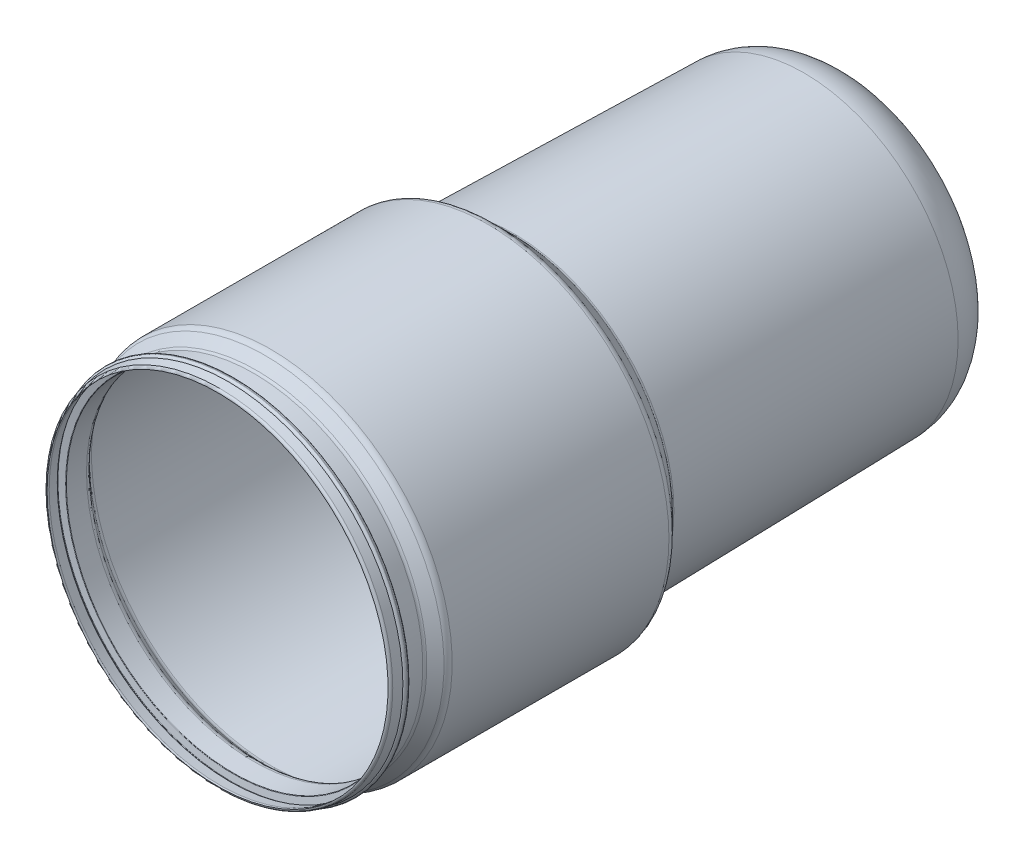
ISO-10303-21;
HEADER;
FILE_DESCRIPTION(('STEP AP214'),'2;1');
FILE_NAME('part.step','',(''),(''),'','','');
FILE_SCHEMA(('AUTOMOTIVE_DESIGN { 1 0 10303 214 1 1 1 1 }'));
ENDSEC;
DATA;
#1=APPLICATION_CONTEXT('core data for automotive mechanical design processes');
#2=APPLICATION_PROTOCOL_DEFINITION('international standard','automotive_design',2000,#1);
#3=PRODUCT_CONTEXT('',#1,'mechanical');
#4=PRODUCT('Part','Part','',(#3));
#5=PRODUCT_RELATED_PRODUCT_CATEGORY('part','',(#4));
#6=PRODUCT_DEFINITION_FORMATION('','',#4);
#7=PRODUCT_DEFINITION_CONTEXT('part definition',#1,'design');
#8=PRODUCT_DEFINITION('design','',#6,#7);
#9=PRODUCT_DEFINITION_SHAPE('','',#8);
#10=(LENGTH_UNIT() NAMED_UNIT(*) SI_UNIT(.MILLI.,.METRE.));
#11=(NAMED_UNIT(*) PLANE_ANGLE_UNIT() SI_UNIT($,.RADIAN.));
#12=(NAMED_UNIT(*) SI_UNIT($,.STERADIAN.) SOLID_ANGLE_UNIT());
#13=UNCERTAINTY_MEASURE_WITH_UNIT(LENGTH_MEASURE(1.E-05),#10,'distance_accuracy_value','');
#14=(GEOMETRIC_REPRESENTATION_CONTEXT(3) GLOBAL_UNCERTAINTY_ASSIGNED_CONTEXT((#13)) GLOBAL_UNIT_ASSIGNED_CONTEXT((#10,
#11,#12)) REPRESENTATION_CONTEXT('',''));
#15=CARTESIAN_POINT('',(0.,0.,0.));
#16=DIRECTION('',(0.,0.,1.));
#17=DIRECTION('',(1.,0.,0.));
#18=AXIS2_PLACEMENT_3D('',#15,#16,#17);
#19=CARTESIAN_POINT('',(0.,0.,660.4));
#20=DIRECTION('',(0.,0.,-1.));
#21=DIRECTION('',(-1.,0.,0.));
#22=AXIS2_PLACEMENT_3D('',#19,#20,#21);
#23=CYLINDRICAL_SURFACE('',#22,178.167487387362);
#24=CARTESIAN_POINT('',(0.,0.,660.4));
#25=DIRECTION('',(0.,0.,-1.));
#26=DIRECTION('',(-1.,0.,0.));
#27=AXIS2_PLACEMENT_3D('',#24,#25,#26);
#28=CIRCLE('',#27,178.167487387362);
#29=CARTESIAN_POINT('',(-178.167487387362,0.,660.4));
#30=VERTEX_POINT('',#29);
#31=EDGE_CURVE('E148',#30,#30,#28,.F.);
#32=ORIENTED_EDGE('',*,*,#31,.F.);
#33=EDGE_LOOP('',(#32));
#34=FACE_BOUND('',#33,.T.);
#35=CARTESIAN_POINT('',(0.,0.,662.6));
#36=DIRECTION('',(0.,0.,-1.));
#37=DIRECTION('',(-1.,0.,0.));
#38=AXIS2_PLACEMENT_3D('',#35,#36,#37);
#39=CIRCLE('',#38,178.167487387362);
#40=CARTESIAN_POINT('',(-178.167487387362,0.,662.6));
#41=VERTEX_POINT('',#40);
#42=EDGE_CURVE('E12',#41,#41,#39,.F.);
#43=ORIENTED_EDGE('',*,*,#42,.T.);
#44=EDGE_LOOP('',(#43));
#45=FACE_BOUND('',#44,.T.);
#46=ADVANCED_FACE('F48',(#34,#45),#23,.F.);
#47=CARTESIAN_POINT('',(0.,0.,-2.20000000000001));
#48=DIRECTION('',(0.,0.,1.));
#49=DIRECTION('',(1.,0.,0.));
#50=AXIS2_PLACEMENT_3D('',#47,#48,#49);
#51=PLANE('',#50);
#52=CARTESIAN_POINT('',(0.,0.,-2.20000000000002));
#53=DIRECTION('',(0.,0.,-1.));
#54=DIRECTION('',(-1.,0.,0.));
#55=AXIS2_PLACEMENT_3D('',#52,#53,#54);
#56=CIRCLE('',#55,107.960944884122);
#57=CARTESIAN_POINT('',(-107.960944884122,0.,-2.20000000000002));
#58=VERTEX_POINT('',#57);
#59=EDGE_CURVE('E112',#58,#58,#56,.T.);
#60=ORIENTED_EDGE('',*,*,#59,.T.);
#61=EDGE_LOOP('',(#60));
#62=FACE_BOUND('',#61,.T.);
#63=ADVANCED_FACE('F219',(#62),#51,.F.);
#64=CARTESIAN_POINT('',(0.,0.,50.8));
#65=DIRECTION('',(0.,0.,-1.));
#66=DIRECTION('',(-1.,0.,0.));
#67=AXIS2_PLACEMENT_3D('',#64,#65,#66);
#68=TOROIDAL_SURFACE('',#67,107.960944884122,53.);
#69=ORIENTED_EDGE('',*,*,#59,.F.);
#70=EDGE_LOOP('',(#69));
#71=FACE_BOUND('',#70,.T.);
#72=CARTESIAN_POINT('',(0.,0.,49.6998771082544));
#73=DIRECTION('',(0.,0.,-1.));
#74=DIRECTION('',(-1.,0.,0.));
#75=AXIS2_PLACEMENT_3D('',#72,#73,#74);
#76=CIRCLE('',#75,160.949526008955);
#77=CARTESIAN_POINT('',(-160.949526008955,0.,49.6998771082544));
#78=VERTEX_POINT('',#77);
#79=EDGE_CURVE('E113',#78,#78,#76,.T.);
#80=ORIENTED_EDGE('',*,*,#79,.T.);
#81=EDGE_LOOP('',(#80));
#82=FACE_BOUND('',#81,.T.);
#83=ADVANCED_FACE('F225',(#71,#82),#68,.T.);
#84=CARTESIAN_POINT('',(0.,0.,355.554334521475));
#85=DIRECTION('',(0.,0.,1.));
#86=DIRECTION('',(1.,0.,0.));
#87=AXIS2_PLACEMENT_3D('',#84,#85,#86);
#88=CONICAL_SURFACE('',#87,167.299526008955,0.0207585265261919);
#89=CARTESIAN_POINT('',(0.,0.,353.001517125793));
#90=DIRECTION('',(0.,0.,1.));
#91=DIRECTION('',(1.,0.,0.));
#92=AXIS2_PLACEMENT_3D('',#89,#90,#91);
#93=CIRCLE('',#92,167.246525668206);
#94=CARTESIAN_POINT('',(167.246525668206,0.,353.001517125793));
#95=VERTEX_POINT('',#94);
#96=EDGE_CURVE('E105',#95,#95,#93,.F.);
#97=ORIENTED_EDGE('',*,*,#96,.T.);
#98=EDGE_LOOP('',(#97));
#99=FACE_BOUND('',#98,.T.);
#100=ORIENTED_EDGE('',*,*,#79,.F.);
#101=EDGE_LOOP('',(#100));
#102=FACE_BOUND('',#101,.T.);
#103=ADVANCED_FACE('F235',(#99,#102),#88,.T.);
#104=CARTESIAN_POINT('',(0.,0.,376.269365081389));
#105=DIRECTION('',(0.,0.,1.));
#106=DIRECTION('',(1.,0.,0.));
#107=AXIS2_PLACEMENT_3D('',#104,#105,#106);
#108=CONICAL_SURFACE('',#107,188.88063491861,0.785398163397451);
#109=CARTESIAN_POINT('',(0.,0.,355.849868569591));
#110=DIRECTION('',(0.,0.,1.));
#111=DIRECTION('',(1.,0.,0.));
#112=AXIS2_PLACEMENT_3D('',#109,#110,#111);
#113=CIRCLE('',#112,168.461138406811);
#114=CARTESIAN_POINT('',(168.461138406811,0.,355.849868569591));
#115=VERTEX_POINT('',#114);
#116=EDGE_CURVE('E97',#115,#115,#113,.T.);
#117=ORIENTED_EDGE('',*,*,#116,.T.);
#118=EDGE_LOOP('',(#117));
#119=FACE_BOUND('',#118,.T.);
#120=CARTESIAN_POINT('',(0.,0.,374.409493141924));
#121=DIRECTION('',(0.,0.,1.));
#122=DIRECTION('',(1.,0.,0.));
#123=AXIS2_PLACEMENT_3D('',#120,#121,#122);
#124=CIRCLE('',#123,187.020762979145);
#125=CARTESIAN_POINT('',(187.020762979145,0.,374.409493141924));
#126=VERTEX_POINT('',#125);
#127=EDGE_CURVE('E101',#126,#126,#124,.F.);
#128=ORIENTED_EDGE('',*,*,#127,.T.);
#129=EDGE_LOOP('',(#128));
#130=FACE_BOUND('',#129,.T.);
#131=ADVANCED_FACE('F239',(#119,#130),#108,.T.);
#132=CARTESIAN_POINT('',(0.,0.,0.));
#133=DIRECTION('',(0.,0.,-1.));
#134=DIRECTION('',(-1.,0.,0.));
#135=AXIS2_PLACEMENT_3D('',#132,#133,#134);
#136=CYLINDRICAL_SURFACE('',#135,189.525);
#137=CARTESIAN_POINT('',(0.,0.,380.455256121069));
#138=DIRECTION('',(0.,0.,-1.));
#139=DIRECTION('',(-1.,0.,0.));
#140=AXIS2_PLACEMENT_3D('',#137,#138,#139);
#141=CIRCLE('',#140,189.525);
#142=CARTESIAN_POINT('',(-189.525,0.,380.455256121069));
#143=VERTEX_POINT('',#142);
#144=EDGE_CURVE('E89',#143,#143,#141,.F.);
#145=ORIENTED_EDGE('',*,*,#144,.T.);
#146=EDGE_LOOP('',(#145));
#147=FACE_BOUND('',#146,.T.);
#148=CARTESIAN_POINT('',(0.,0.,606.969743878931));
#149=DIRECTION('',(0.,0.,-1.));
#150=DIRECTION('',(-1.,0.,0.));
#151=AXIS2_PLACEMENT_3D('',#148,#149,#150);
#152=CIRCLE('',#151,189.525);
#153=CARTESIAN_POINT('',(-189.525,0.,606.969743878931));
#154=VERTEX_POINT('',#153);
#155=EDGE_CURVE('E93',#154,#154,#152,.T.);
#156=ORIENTED_EDGE('',*,*,#155,.T.);
#157=EDGE_LOOP('',(#156));
#158=FACE_BOUND('',#157,.T.);
#159=ADVANCED_FACE('F243',(#147,#158),#136,.T.);
#160=CARTESIAN_POINT('',(0.,0.,623.85563491861));
#161=DIRECTION('',(0.,0.,-1.));
#162=DIRECTION('',(-1.,0.,0.));
#163=AXIS2_PLACEMENT_3D('',#160,#161,#162);
#164=CONICAL_SURFACE('',#163,176.18063491861,0.78539816339745);
#165=CARTESIAN_POINT('',(0.,0.,613.015506858076));
#166=DIRECTION('',(0.,0.,-1.));
#167=DIRECTION('',(-1.,0.,0.));
#168=AXIS2_PLACEMENT_3D('',#165,#166,#167);
#169=CIRCLE('',#168,187.020762979145);
#170=CARTESIAN_POINT('',(-187.020762979145,0.,613.015506858076));
#171=VERTEX_POINT('',#170);
#172=EDGE_CURVE('E84',#171,#171,#169,.F.);
#173=ORIENTED_EDGE('',*,*,#172,.T.);
#174=EDGE_LOOP('',(#173));
#175=FACE_BOUND('',#174,.T.);
#176=CARTESIAN_POINT('',(0.,0.,621.995762979145));
#177=DIRECTION('',(0.,0.,-1.));
#178=DIRECTION('',(-1.,0.,0.));
#179=AXIS2_PLACEMENT_3D('',#176,#177,#178);
#180=CIRCLE('',#179,178.040506858076);
#181=CARTESIAN_POINT('',(-178.040506858076,0.,621.995762979145));
#182=VERTEX_POINT('',#181);
#183=EDGE_CURVE('E85',#182,#182,#180,.T.);
#184=ORIENTED_EDGE('',*,*,#183,.T.);
#185=EDGE_LOOP('',(#184));
#186=FACE_BOUND('',#185,.T.);
#187=ADVANCED_FACE('F247',(#175,#186),#164,.T.);
#188=CARTESIAN_POINT('',(0.,0.,0.));
#189=DIRECTION('',(0.,0.,-1.));
#190=DIRECTION('',(-1.,0.,0.));
#191=AXIS2_PLACEMENT_3D('',#188,#189,#190);
#192=CYLINDRICAL_SURFACE('',#191,176.825);
#193=CARTESIAN_POINT('',(0.,0.,644.528763019001));
#194=DIRECTION('',(0.,0.,1.));
#195=DIRECTION('',(1.,0.,0.));
#196=AXIS2_PLACEMENT_3D('',#193,#194,#195);
#197=CIRCLE('',#196,176.825);
#198=CARTESIAN_POINT('',(176.825,0.,644.528763019001));
#199=VERTEX_POINT('',#198);
#200=EDGE_CURVE('E57',#199,#199,#197,.F.);
#201=ORIENTED_EDGE('',*,*,#200,.T.);
#202=EDGE_LOOP('',(#201));
#203=FACE_BOUND('',#202,.T.);
#204=CARTESIAN_POINT('',(0.,0.,624.930256121069));
#205=DIRECTION('',(0.,0.,-1.));
#206=DIRECTION('',(-1.,0.,0.));
#207=AXIS2_PLACEMENT_3D('',#204,#205,#206);
#208=CIRCLE('',#207,176.825);
#209=CARTESIAN_POINT('',(-176.825,0.,624.930256121069));
#210=VERTEX_POINT('',#209);
#211=EDGE_CURVE('E69',#210,#210,#208,.F.);
#212=ORIENTED_EDGE('',*,*,#211,.T.);
#213=EDGE_LOOP('',(#212));
#214=FACE_BOUND('',#213,.T.);
#215=ADVANCED_FACE('F251',(#203,#214),#192,.T.);
#216=CARTESIAN_POINT('',(0.,0.,645.533422943373));
#217=DIRECTION('',(0.,0.,1.));
#218=DIRECTION('',(1.,0.,0.));
#219=AXIS2_PLACEMENT_3D('',#216,#217,#218);
#220=CONICAL_SURFACE('',#219,182.52270956399,1.39626340159547);
#221=CARTESIAN_POINT('',(0.,0.,645.459403217481));
#222=DIRECTION('',(0.,0.,1.));
#223=DIRECTION('',(1.,0.,0.));
#224=AXIS2_PLACEMENT_3D('',#221,#222,#223);
#225=CIRCLE('',#224,182.102922838245);
#226=CARTESIAN_POINT('',(182.102922838245,0.,645.459403217481));
#227=VERTEX_POINT('',#226);
#228=EDGE_CURVE('E62',#227,#227,#225,.F.);
#229=ORIENTED_EDGE('',*,*,#228,.T.);
#230=EDGE_LOOP('',(#229));
#231=FACE_BOUND('',#230,.T.);
#232=ORIENTED_EDGE('',*,*,#200,.F.);
#233=EDGE_LOOP('',(#232));
#234=FACE_BOUND('',#233,.T.);
#235=ADVANCED_FACE('F255',(#231,#234),#220,.T.);
#236=CARTESIAN_POINT('',(0.,0.,0.));
#237=DIRECTION('',(0.,0.,-1.));
#238=DIRECTION('',(-1.,0.,0.));
#239=AXIS2_PLACEMENT_3D('',#236,#237,#238);
#240=CYLINDRICAL_SURFACE('',#239,184.340683573123);
#241=CARTESIAN_POINT('',(0.,0.,648.7795));
#242=DIRECTION('',(0.,0.,-1.));
#243=DIRECTION('',(-1.,0.,0.));
#244=AXIS2_PLACEMENT_3D('',#241,#242,#243);
#245=CIRCLE('',#244,184.340683573123);
#246=CARTESIAN_POINT('',(-184.340683573123,0.,648.7795));
#247=VERTEX_POINT('',#246);
#248=EDGE_CURVE('E70',#247,#247,#245,.T.);
#249=ORIENTED_EDGE('',*,*,#248,.T.);
#250=EDGE_LOOP('',(#249));
#251=FACE_BOUND('',#250,.T.);
#252=CARTESIAN_POINT('',(0.,0.,648.126262612638));
#253=DIRECTION('',(0.,0.,-1.));
#254=DIRECTION('',(-1.,0.,0.));
#255=AXIS2_PLACEMENT_3D('',#252,#253,#254);
#256=CIRCLE('',#255,184.340683573123);
#257=CARTESIAN_POINT('',(-184.340683573123,0.,648.126262612638));
#258=VERTEX_POINT('',#257);
#259=EDGE_CURVE('E74',#258,#258,#256,.F.);
#260=ORIENTED_EDGE('',*,*,#259,.T.);
#261=EDGE_LOOP('',(#260));
#262=FACE_BOUND('',#261,.T.);
#263=ADVANCED_FACE('F259',(#251,#262),#240,.T.);
#264=CARTESIAN_POINT('',(0.,0.,660.782025990867));
#265=DIRECTION('',(0.,0.,-1.));
#266=DIRECTION('',(-1.,0.,0.));
#267=AXIS2_PLACEMENT_3D('',#264,#265,#266);
#268=CONICAL_SURFACE('',#267,180.760327056627,0.174532925199429);
#269=CARTESIAN_POINT('',(0.,0.,660.362239265122));
#270=DIRECTION('',(0.,0.,-1.));
#271=DIRECTION('',(-1.,0.,0.));
#272=AXIS2_PLACEMENT_3D('',#269,#270,#271);
#273=CIRCLE('',#272,180.834346782519);
#274=CARTESIAN_POINT('',(-180.834346782519,0.,660.362239265122));
#275=VERTEX_POINT('',#274);
#276=EDGE_CURVE('E65',#275,#275,#273,.T.);
#277=ORIENTED_EDGE('',*,*,#276,.T.);
#278=EDGE_LOOP('',(#277));
#279=FACE_BOUND('',#278,.T.);
#280=CARTESIAN_POINT('',(0.,0.,651.370577225404));
#281=DIRECTION('',(0.,0.,-1.));
#282=DIRECTION('',(-1.,0.,0.));
#283=AXIS2_PLACEMENT_3D('',#280,#281,#282);
#284=CIRCLE('',#283,182.419819401533);
#285=CARTESIAN_POINT('',(-182.419819401533,0.,651.370577225404));
#286=VERTEX_POINT('',#285);
#287=EDGE_CURVE('E52',#286,#286,#284,.F.);
#288=ORIENTED_EDGE('',*,*,#287,.T.);
#289=EDGE_LOOP('',(#288));
#290=FACE_BOUND('',#289,.T.);
#291=ADVANCED_FACE('F263',(#279,#290),#268,.T.);
#292=CARTESIAN_POINT('',(0.,0.,352.915375427666));
#293=DIRECTION('',(0.,0.,-1.));
#294=DIRECTION('',(-1.,0.,0.));
#295=AXIS2_PLACEMENT_3D('',#292,#293,#294);
#296=TOROIDAL_SURFACE('',#295,171.395631548736,4.15);
#297=ORIENTED_EDGE('',*,*,#116,.F.);
#298=EDGE_LOOP('',(#297));
#299=FACE_BOUND('',#298,.T.);
#300=ORIENTED_EDGE('',*,*,#96,.F.);
#301=EDGE_LOOP('',(#300));
#302=FACE_BOUND('',#301,.T.);
#303=ADVANCED_FACE('F267',(#299,#302),#296,.F.);
#304=CARTESIAN_POINT('',(0.,0.,380.455256121069));
#305=DIRECTION('',(0.,0.,1.));
#306=DIRECTION('',(1.,0.,0.));
#307=AXIS2_PLACEMENT_3D('',#304,#305,#306);
#308=TOROIDAL_SURFACE('',#307,180.975,8.55);
#309=ORIENTED_EDGE('',*,*,#144,.F.);
#310=EDGE_LOOP('',(#309));
#311=FACE_BOUND('',#310,.T.);
#312=ORIENTED_EDGE('',*,*,#127,.F.);
#313=EDGE_LOOP('',(#312));
#314=FACE_BOUND('',#313,.T.);
#315=ADVANCED_FACE('F271',(#311,#314),#308,.T.);
#316=CARTESIAN_POINT('',(0.,0.,606.969743878931));
#317=DIRECTION('',(0.,0.,1.));
#318=DIRECTION('',(1.,0.,0.));
#319=AXIS2_PLACEMENT_3D('',#316,#317,#318);
#320=TOROIDAL_SURFACE('',#319,180.975,8.55);
#321=ORIENTED_EDGE('',*,*,#172,.F.);
#322=EDGE_LOOP('',(#321));
#323=FACE_BOUND('',#322,.T.);
#324=ORIENTED_EDGE('',*,*,#155,.F.);
#325=EDGE_LOOP('',(#324));
#326=FACE_BOUND('',#325,.T.);
#327=ADVANCED_FACE('F275',(#323,#326),#320,.T.);
#328=CARTESIAN_POINT('',(0.,0.,624.930256121069));
#329=DIRECTION('',(0.,0.,-1.));
#330=DIRECTION('',(-1.,0.,0.));
#331=AXIS2_PLACEMENT_3D('',#328,#329,#330);
#332=TOROIDAL_SURFACE('',#331,180.975,4.15);
#333=ORIENTED_EDGE('',*,*,#211,.F.);
#334=EDGE_LOOP('',(#333));
#335=FACE_BOUND('',#334,.T.);
#336=ORIENTED_EDGE('',*,*,#183,.F.);
#337=EDGE_LOOP('',(#336));
#338=FACE_BOUND('',#337,.T.);
#339=ADVANCED_FACE('F279',(#335,#338),#332,.F.);
#340=CARTESIAN_POINT('',(0.,0.,659.892));
#341=DIRECTION('',(0.,0.,-1.));
#342=DIRECTION('',(-1.,0.,0.));
#343=AXIS2_PLACEMENT_3D('',#340,#341,#342);
#344=TOROIDAL_SURFACE('',#343,178.167487387362,2.708);
#345=ORIENTED_EDGE('',*,*,#42,.F.);
#346=EDGE_LOOP('',(#345));
#347=FACE_BOUND('',#346,.T.);
#348=ORIENTED_EDGE('',*,*,#276,.F.);
#349=EDGE_LOOP('',(#348));
#350=FACE_BOUND('',#349,.T.);
#351=ADVANCED_FACE('F283',(#347,#350),#344,.T.);
#352=CARTESIAN_POINT('',(0.,0.,648.7795));
#353=DIRECTION('',(0.,0.,-1.));
#354=DIRECTION('',(-1.,0.,0.));
#355=AXIS2_PLACEMENT_3D('',#352,#353,#354);
#356=TOROIDAL_SURFACE('',#355,181.632683573123,2.708);
#357=ORIENTED_EDGE('',*,*,#287,.F.);
#358=EDGE_LOOP('',(#357));
#359=FACE_BOUND('',#358,.T.);
#360=ORIENTED_EDGE('',*,*,#248,.F.);
#361=EDGE_LOOP('',(#360));
#362=FACE_BOUND('',#361,.T.);
#363=ADVANCED_FACE('F50',(#359,#362),#356,.T.);
#364=CARTESIAN_POINT('',(0.,0.,648.126262612638));
#365=DIRECTION('',(0.,0.,1.));
#366=DIRECTION('',(1.,0.,0.));
#367=AXIS2_PLACEMENT_3D('',#364,#365,#366);
#368=TOROIDAL_SURFACE('',#367,181.632683573123,2.708);
#369=ORIENTED_EDGE('',*,*,#259,.F.);
#370=EDGE_LOOP('',(#369));
#371=FACE_BOUND('',#370,.T.);
#372=ORIENTED_EDGE('',*,*,#228,.F.);
#373=EDGE_LOOP('',(#372));
#374=FACE_BOUND('',#373,.T.);
#375=ADVANCED_FACE('F215',(#371,#374),#368,.T.);
#376=CARTESIAN_POINT('',(0.,0.,0.));
#377=DIRECTION('',(0.,0.,1.));
#378=DIRECTION('',(1.,0.,0.));
#379=AXIS2_PLACEMENT_3D('',#376,#377,#378);
#380=PLANE('',#379);
#381=CARTESIAN_POINT('',(0.,0.,0.));
#382=DIRECTION('',(0.,0.,-1.));
#383=DIRECTION('',(-1.,0.,0.));
#384=AXIS2_PLACEMENT_3D('',#381,#382,#383);
#385=CIRCLE('',#384,107.960944884122);
#386=CARTESIAN_POINT('',(-107.960944884122,0.,0.));
#387=VERTEX_POINT('',#386);
#388=EDGE_CURVE('E192',#387,#387,#385,.T.);
#389=ORIENTED_EDGE('',*,*,#388,.F.);
#390=EDGE_LOOP('',(#389));
#391=FACE_BOUND('',#390,.T.);
#392=ADVANCED_FACE('F205',(#391),#380,.T.);
#393=CARTESIAN_POINT('',(0.,0.,50.8));
#394=DIRECTION('',(0.,0.,-1.));
#395=DIRECTION('',(-1.,0.,0.));
#396=AXIS2_PLACEMENT_3D('',#393,#394,#395);
#397=TOROIDAL_SURFACE('',#396,107.960944884122,50.8);
#398=ORIENTED_EDGE('',*,*,#388,.T.);
#399=EDGE_LOOP('',(#398));
#400=FACE_BOUND('',#399,.T.);
#401=CARTESIAN_POINT('',(0.,0.,49.7455425867797));
#402=DIRECTION('',(0.,0.,-1.));
#403=DIRECTION('',(-1.,0.,0.));
#404=AXIS2_PLACEMENT_3D('',#401,#402,#403);
#405=CIRCLE('',#404,158.75);
#406=CARTESIAN_POINT('',(-158.75,0.,49.7455425867797));
#407=VERTEX_POINT('',#406);
#408=EDGE_CURVE('E196',#407,#407,#405,.T.);
#409=ORIENTED_EDGE('',*,*,#408,.F.);
#410=EDGE_LOOP('',(#409));
#411=FACE_BOUND('',#410,.T.);
#412=ADVANCED_FACE('F203',(#400,#411),#397,.F.);
#413=CARTESIAN_POINT('',(0.,0.,355.6));
#414=DIRECTION('',(0.,0.,1.));
#415=DIRECTION('',(1.,0.,0.));
#416=AXIS2_PLACEMENT_3D('',#413,#414,#415);
#417=CONICAL_SURFACE('',#416,165.1,0.0207585265261919);
#418=CARTESIAN_POINT('',(0.,0.,353.047182604319));
#419=DIRECTION('',(0.,0.,1.));
#420=DIRECTION('',(1.,0.,0.));
#421=AXIS2_PLACEMENT_3D('',#418,#419,#420);
#422=CIRCLE('',#421,165.046999659251);
#423=CARTESIAN_POINT('',(165.046999659251,0.,353.047182604319));
#424=VERTEX_POINT('',#423);
#425=EDGE_CURVE('E188',#424,#424,#422,.F.);
#426=ORIENTED_EDGE('',*,*,#425,.F.);
#427=EDGE_LOOP('',(#426));
#428=FACE_BOUND('',#427,.T.);
#429=ORIENTED_EDGE('',*,*,#408,.T.);
#430=EDGE_LOOP('',(#429));
#431=FACE_BOUND('',#430,.T.);
#432=ADVANCED_FACE('F201',(#428,#431),#417,.F.);
#433=CARTESIAN_POINT('',(0.,0.,377.825));
#434=DIRECTION('',(0.,0.,1.));
#435=DIRECTION('',(1.,0.,0.));
#436=AXIS2_PLACEMENT_3D('',#433,#434,#435);
#437=CONICAL_SURFACE('',#436,187.325,0.785398163397451);
#438=CARTESIAN_POINT('',(0.,0.,357.405503488201));
#439=DIRECTION('',(0.,0.,1.));
#440=DIRECTION('',(1.,0.,0.));
#441=AXIS2_PLACEMENT_3D('',#438,#439,#440);
#442=CIRCLE('',#441,166.905503488201);
#443=CARTESIAN_POINT('',(166.905503488201,0.,357.405503488201));
#444=VERTEX_POINT('',#443);
#445=EDGE_CURVE('E180',#444,#444,#442,.T.);
#446=ORIENTED_EDGE('',*,*,#445,.F.);
#447=EDGE_LOOP('',(#446));
#448=FACE_BOUND('',#447,.T.);
#449=CARTESIAN_POINT('',(0.,0.,375.965128060534));
#450=DIRECTION('',(0.,0.,-1.));
#451=DIRECTION('',(-1.,0.,0.));
#452=AXIS2_PLACEMENT_3D('',#449,#450,#451);
#453=CIRCLE('',#452,185.465128060535);
#454=CARTESIAN_POINT('',(-185.465128060535,0.,375.965128060534));
#455=VERTEX_POINT('',#454);
#456=EDGE_CURVE('E184',#455,#455,#453,.T.);
#457=ORIENTED_EDGE('',*,*,#456,.F.);
#458=EDGE_LOOP('',(#457));
#459=FACE_BOUND('',#458,.T.);
#460=ADVANCED_FACE('F212',(#448,#459),#437,.F.);
#461=CARTESIAN_POINT('',(0.,0.,0.));
#462=DIRECTION('',(0.,0.,-1.));
#463=DIRECTION('',(-1.,0.,0.));
#464=AXIS2_PLACEMENT_3D('',#461,#462,#463);
#465=CYLINDRICAL_SURFACE('',#464,187.325);
#466=CARTESIAN_POINT('',(0.,0.,380.455256121069));
#467=DIRECTION('',(0.,0.,1.));
#468=DIRECTION('',(1.,0.,0.));
#469=AXIS2_PLACEMENT_3D('',#466,#467,#468);
#470=CIRCLE('',#469,187.325);
#471=CARTESIAN_POINT('',(187.325,0.,380.455256121069));
#472=VERTEX_POINT('',#471);
#473=EDGE_CURVE('E172',#472,#472,#470,.T.);
#474=ORIENTED_EDGE('',*,*,#473,.F.);
#475=EDGE_LOOP('',(#474));
#476=FACE_BOUND('',#475,.T.);
#477=CARTESIAN_POINT('',(0.,0.,606.969743878931));
#478=DIRECTION('',(0.,0.,1.));
#479=DIRECTION('',(1.,0.,0.));
#480=AXIS2_PLACEMENT_3D('',#477,#478,#479);
#481=CIRCLE('',#480,187.325);
#482=CARTESIAN_POINT('',(187.325,0.,606.969743878931));
#483=VERTEX_POINT('',#482);
#484=EDGE_CURVE('E176',#483,#483,#481,.F.);
#485=ORIENTED_EDGE('',*,*,#484,.F.);
#486=EDGE_LOOP('',(#485));
#487=FACE_BOUND('',#486,.T.);
#488=ADVANCED_FACE('F524',(#476,#487),#465,.F.);
#489=CARTESIAN_POINT('',(0.,0.,622.3));
#490=DIRECTION('',(0.,0.,-1.));
#491=DIRECTION('',(-1.,0.,0.));
#492=AXIS2_PLACEMENT_3D('',#489,#490,#491);
#493=CONICAL_SURFACE('',#492,174.625,0.78539816339745);
#494=CARTESIAN_POINT('',(0.,0.,611.459871939466));
#495=DIRECTION('',(0.,0.,1.));
#496=DIRECTION('',(1.,0.,0.));
#497=AXIS2_PLACEMENT_3D('',#494,#495,#496);
#498=CIRCLE('',#497,185.465128060535);
#499=CARTESIAN_POINT('',(185.465128060535,0.,611.459871939466));
#500=VERTEX_POINT('',#499);
#501=EDGE_CURVE('E164',#500,#500,#498,.T.);
#502=ORIENTED_EDGE('',*,*,#501,.F.);
#503=EDGE_LOOP('',(#502));
#504=FACE_BOUND('',#503,.T.);
#505=CARTESIAN_POINT('',(0.,0.,620.440128060535));
#506=DIRECTION('',(0.,0.,-1.));
#507=DIRECTION('',(-1.,0.,0.));
#508=AXIS2_PLACEMENT_3D('',#505,#506,#507);
#509=CIRCLE('',#508,176.484871939465);
#510=CARTESIAN_POINT('',(-176.484871939465,0.,620.440128060535));
#511=VERTEX_POINT('',#510);
#512=EDGE_CURVE('E168',#511,#511,#509,.T.);
#513=ORIENTED_EDGE('',*,*,#512,.F.);
#514=EDGE_LOOP('',(#513));
#515=FACE_BOUND('',#514,.T.);
#516=ADVANCED_FACE('F515',(#504,#515),#493,.F.);
#517=CARTESIAN_POINT('',(0.,0.,0.));
#518=DIRECTION('',(0.,0.,-1.));
#519=DIRECTION('',(-1.,0.,0.));
#520=AXIS2_PLACEMENT_3D('',#517,#518,#519);
#521=CYLINDRICAL_SURFACE('',#520,174.625);
#522=CARTESIAN_POINT('',(0.,0.,645.948519594953));
#523=DIRECTION('',(0.,0.,-1.));
#524=DIRECTION('',(-1.,0.,0.));
#525=AXIS2_PLACEMENT_3D('',#522,#523,#524);
#526=CIRCLE('',#525,174.625);
#527=CARTESIAN_POINT('',(-174.625,0.,645.948519594953));
#528=VERTEX_POINT('',#527);
#529=EDGE_CURVE('E117',#528,#528,#526,.T.);
#530=ORIENTED_EDGE('',*,*,#529,.F.);
#531=EDGE_LOOP('',(#530));
#532=FACE_BOUND('',#531,.T.);
#533=CARTESIAN_POINT('',(0.,0.,624.930256121069));
#534=DIRECTION('',(0.,0.,-1.));
#535=DIRECTION('',(-1.,0.,0.));
#536=AXIS2_PLACEMENT_3D('',#533,#534,#535);
#537=CIRCLE('',#536,174.625);
#538=CARTESIAN_POINT('',(-174.625,0.,624.930256121069));
#539=VERTEX_POINT('',#538);
#540=EDGE_CURVE('E160',#539,#539,#537,.F.);
#541=ORIENTED_EDGE('',*,*,#540,.F.);
#542=EDGE_LOOP('',(#541));
#543=FACE_BOUND('',#542,.T.);
#544=ADVANCED_FACE('F506',(#532,#543),#521,.F.);
#545=CARTESIAN_POINT('',(0.,0.,647.7));
#546=DIRECTION('',(0.,0.,1.));
#547=DIRECTION('',(1.,0.,0.));
#548=AXIS2_PLACEMENT_3D('',#545,#546,#547);
#549=CONICAL_SURFACE('',#548,182.140683573123,1.39626340159547);
#550=CARTESIAN_POINT('',(0.,0.,647.625980274108));
#551=DIRECTION('',(0.,0.,-1.));
#552=DIRECTION('',(-1.,0.,0.));
#553=AXIS2_PLACEMENT_3D('',#550,#551,#552);
#554=CIRCLE('',#553,181.720896847378);
#555=CARTESIAN_POINT('',(-181.720896847378,0.,647.625980274108));
#556=VERTEX_POINT('',#555);
#557=EDGE_CURVE('E124',#556,#556,#554,.T.);
#558=ORIENTED_EDGE('',*,*,#557,.F.);
#559=EDGE_LOOP('',(#558));
#560=FACE_BOUND('',#559,.T.);
#561=CARTESIAN_POINT('',(0.,0.,646.448801933483));
#562=DIRECTION('',(0.,0.,1.));
#563=DIRECTION('',(1.,0.,0.));
#564=AXIS2_PLACEMENT_3D('',#561,#562,#563);
#565=CIRCLE('',#564,175.044786725745);
#566=CARTESIAN_POINT('',(175.044786725745,0.,646.448801933483));
#567=VERTEX_POINT('',#566);
#568=EDGE_CURVE('E128',#567,#567,#565,.T.);
#569=ORIENTED_EDGE('',*,*,#568,.F.);
#570=EDGE_LOOP('',(#569));
#571=FACE_BOUND('',#570,.T.);
#572=ADVANCED_FACE('F497',(#560,#571),#549,.F.);
#573=CARTESIAN_POINT('',(0.,0.,0.));
#574=DIRECTION('',(0.,0.,-1.));
#575=DIRECTION('',(-1.,0.,0.));
#576=AXIS2_PLACEMENT_3D('',#573,#574,#575);
#577=CYLINDRICAL_SURFACE('',#576,182.140683573123);
#578=CARTESIAN_POINT('',(0.,0.,648.7795));
#579=DIRECTION('',(0.,0.,-1.));
#580=DIRECTION('',(-1.,0.,0.));
#581=AXIS2_PLACEMENT_3D('',#578,#579,#580);
#582=CIRCLE('',#581,182.140683573123);
#583=CARTESIAN_POINT('',(-182.140683573123,0.,648.7795));
#584=VERTEX_POINT('',#583);
#585=EDGE_CURVE('E132',#584,#584,#582,.T.);
#586=ORIENTED_EDGE('',*,*,#585,.F.);
#587=EDGE_LOOP('',(#586));
#588=FACE_BOUND('',#587,.T.);
#589=CARTESIAN_POINT('',(0.,0.,648.126262612638));
#590=DIRECTION('',(0.,0.,1.));
#591=DIRECTION('',(1.,0.,0.));
#592=AXIS2_PLACEMENT_3D('',#589,#590,#591);
#593=CIRCLE('',#592,182.140683573123);
#594=CARTESIAN_POINT('',(182.140683573123,0.,648.126262612638));
#595=VERTEX_POINT('',#594);
#596=EDGE_CURVE('E136',#595,#595,#593,.T.);
#597=ORIENTED_EDGE('',*,*,#596,.F.);
#598=EDGE_LOOP('',(#597));
#599=FACE_BOUND('',#598,.T.);
#600=ADVANCED_FACE('F488',(#588,#599),#577,.F.);
#601=CARTESIAN_POINT('',(182.140683573123,0.,649.2875));
#602=DIRECTION('',(0.,0.,-1.));
#603=DIRECTION('',(-1.,0.,0.));
#604=AXIS2_PLACEMENT_3D('',#601,#602,#603);
#605=PLANE('',#604);
#606=CARTESIAN_POINT('',(0.,0.,649.2875));
#607=DIRECTION('',(0.,0.,-1.));
#608=DIRECTION('',(-1.,0.,0.));
#609=AXIS2_PLACEMENT_3D('',#606,#607,#608);
#610=CIRCLE('',#609,180.979446185761);
#611=CARTESIAN_POINT('',(-180.979446185761,0.,649.2875));
#612=VERTEX_POINT('',#611);
#613=EDGE_CURVE('E140',#612,#612,#610,.T.);
#614=ORIENTED_EDGE('',*,*,#613,.F.);
#615=EDGE_LOOP('',(#614));
#616=FACE_BOUND('',#615,.T.);
#617=CARTESIAN_POINT('',(0.,0.,649.2875));
#618=DIRECTION('',(0.,0.,-1.));
#619=DIRECTION('',(-1.,0.,0.));
#620=AXIS2_PLACEMENT_3D('',#617,#618,#619);
#621=CIRCLE('',#620,181.632683573123);
#622=CARTESIAN_POINT('',(-181.632683573123,0.,649.2875));
#623=VERTEX_POINT('',#622);
#624=EDGE_CURVE('E144',#623,#623,#621,.F.);
#625=ORIENTED_EDGE('',*,*,#624,.F.);
#626=EDGE_LOOP('',(#625));
#627=FACE_BOUND('',#626,.T.);
#628=ADVANCED_FACE('F478',(#616,#627),#605,.T.);
#629=CARTESIAN_POINT('',(0.,0.,660.4));
#630=DIRECTION('',(0.,0.,-1.));
#631=DIRECTION('',(-1.,0.,0.));
#632=AXIS2_PLACEMENT_3D('',#629,#630,#631);
#633=CONICAL_SURFACE('',#632,178.59375,0.174532925199429);
#634=CARTESIAN_POINT('',(0.,0.,659.980213274255));
#635=DIRECTION('',(0.,0.,1.));
#636=DIRECTION('',(1.,0.,0.));
#637=AXIS2_PLACEMENT_3D('',#634,#635,#636);
#638=CIRCLE('',#637,178.667769725892);
#639=CARTESIAN_POINT('',(178.667769725892,0.,659.980213274255));
#640=VERTEX_POINT('',#639);
#641=EDGE_CURVE('E152',#640,#640,#638,.F.);
#642=ORIENTED_EDGE('',*,*,#641,.F.);
#643=EDGE_LOOP('',(#642));
#644=FACE_BOUND('',#643,.T.);
#645=CARTESIAN_POINT('',(0.,0.,649.707286725745));
#646=DIRECTION('',(0.,0.,-1.));
#647=DIRECTION('',(-1.,0.,0.));
#648=AXIS2_PLACEMENT_3D('',#645,#646,#647);
#649=CIRCLE('',#648,180.479163847231);
#650=CARTESIAN_POINT('',(-180.479163847231,0.,649.707286725745));
#651=VERTEX_POINT('',#650);
#652=EDGE_CURVE('E156',#651,#651,#649,.F.);
#653=ORIENTED_EDGE('',*,*,#652,.F.);
#654=EDGE_LOOP('',(#653));
#655=FACE_BOUND('',#654,.T.);
#656=ADVANCED_FACE('F470',(#644,#655),#633,.F.);
#657=CARTESIAN_POINT('',(0.,0.,352.915375427666));
#658=DIRECTION('',(0.,0.,-1.));
#659=DIRECTION('',(-1.,0.,0.));
#660=AXIS2_PLACEMENT_3D('',#657,#658,#659);
#661=TOROIDAL_SURFACE('',#660,171.395631548736,6.35);
#662=ORIENTED_EDGE('',*,*,#445,.T.);
#663=EDGE_LOOP('',(#662));
#664=FACE_BOUND('',#663,.T.);
#665=ORIENTED_EDGE('',*,*,#425,.T.);
#666=EDGE_LOOP('',(#665));
#667=FACE_BOUND('',#666,.T.);
#668=ADVANCED_FACE('F461',(#664,#667),#661,.T.);
#669=CARTESIAN_POINT('',(0.,0.,380.455256121069));
#670=DIRECTION('',(0.,0.,1.));
#671=DIRECTION('',(1.,0.,0.));
#672=AXIS2_PLACEMENT_3D('',#669,#670,#671);
#673=TOROIDAL_SURFACE('',#672,180.975,6.35);
#674=ORIENTED_EDGE('',*,*,#473,.T.);
#675=EDGE_LOOP('',(#674));
#676=FACE_BOUND('',#675,.T.);
#677=ORIENTED_EDGE('',*,*,#456,.T.);
#678=EDGE_LOOP('',(#677));
#679=FACE_BOUND('',#678,.T.);
#680=ADVANCED_FACE('F452',(#676,#679),#673,.F.);
#681=CARTESIAN_POINT('',(0.,0.,606.969743878931));
#682=DIRECTION('',(0.,0.,1.));
#683=DIRECTION('',(1.,0.,0.));
#684=AXIS2_PLACEMENT_3D('',#681,#682,#683);
#685=TOROIDAL_SURFACE('',#684,180.975,6.35);
#686=ORIENTED_EDGE('',*,*,#501,.T.);
#687=EDGE_LOOP('',(#686));
#688=FACE_BOUND('',#687,.T.);
#689=ORIENTED_EDGE('',*,*,#484,.T.);
#690=EDGE_LOOP('',(#689));
#691=FACE_BOUND('',#690,.T.);
#692=ADVANCED_FACE('F443',(#688,#691),#685,.F.);
#693=CARTESIAN_POINT('',(0.,0.,624.930256121069));
#694=DIRECTION('',(0.,0.,-1.));
#695=DIRECTION('',(-1.,0.,0.));
#696=AXIS2_PLACEMENT_3D('',#693,#694,#695);
#697=TOROIDAL_SURFACE('',#696,180.975,6.35);
#698=ORIENTED_EDGE('',*,*,#540,.T.);
#699=EDGE_LOOP('',(#698));
#700=FACE_BOUND('',#699,.T.);
#701=ORIENTED_EDGE('',*,*,#512,.T.);
#702=EDGE_LOOP('',(#701));
#703=FACE_BOUND('',#702,.T.);
#704=ADVANCED_FACE('F434',(#700,#703),#697,.T.);
#705=CARTESIAN_POINT('',(0.,0.,659.892));
#706=DIRECTION('',(0.,0.,-1.));
#707=DIRECTION('',(-1.,0.,0.));
#708=AXIS2_PLACEMENT_3D('',#705,#706,#707);
#709=TOROIDAL_SURFACE('',#708,178.167487387362,0.508);
#710=ORIENTED_EDGE('',*,*,#31,.T.);
#711=EDGE_LOOP('',(#710));
#712=FACE_BOUND('',#711,.T.);
#713=ORIENTED_EDGE('',*,*,#641,.T.);
#714=EDGE_LOOP('',(#713));
#715=FACE_BOUND('',#714,.T.);
#716=ADVANCED_FACE('F425',(#712,#715),#709,.F.);
#717=CARTESIAN_POINT('',(0.,0.,649.7955));
#718=DIRECTION('',(0.,0.,-1.));
#719=DIRECTION('',(-1.,0.,0.));
#720=AXIS2_PLACEMENT_3D('',#717,#718,#719);
#721=TOROIDAL_SURFACE('',#720,180.979446185761,0.508);
#722=ORIENTED_EDGE('',*,*,#652,.T.);
#723=EDGE_LOOP('',(#722));
#724=FACE_BOUND('',#723,.T.);
#725=ORIENTED_EDGE('',*,*,#613,.T.);
#726=EDGE_LOOP('',(#725));
#727=FACE_BOUND('',#726,.T.);
#728=ADVANCED_FACE('F416',(#724,#727),#721,.T.);
#729=CARTESIAN_POINT('',(0.,0.,648.7795));
#730=DIRECTION('',(0.,0.,-1.));
#731=DIRECTION('',(-1.,0.,0.));
#732=AXIS2_PLACEMENT_3D('',#729,#730,#731);
#733=TOROIDAL_SURFACE('',#732,181.632683573123,0.508);
#734=ORIENTED_EDGE('',*,*,#624,.T.);
#735=EDGE_LOOP('',(#734));
#736=FACE_BOUND('',#735,.T.);
#737=ORIENTED_EDGE('',*,*,#585,.T.);
#738=EDGE_LOOP('',(#737));
#739=FACE_BOUND('',#738,.T.);
#740=ADVANCED_FACE('F408',(#736,#739),#733,.F.);
#741=CARTESIAN_POINT('',(0.,0.,648.126262612638));
#742=DIRECTION('',(0.,0.,1.));
#743=DIRECTION('',(1.,0.,0.));
#744=AXIS2_PLACEMENT_3D('',#741,#742,#743);
#745=TOROIDAL_SURFACE('',#744,181.632683573123,0.508);
#746=ORIENTED_EDGE('',*,*,#596,.T.);
#747=EDGE_LOOP('',(#746));
#748=FACE_BOUND('',#747,.T.);
#749=ORIENTED_EDGE('',*,*,#557,.T.);
#750=EDGE_LOOP('',(#749));
#751=FACE_BOUND('',#750,.T.);
#752=ADVANCED_FACE('F399',(#748,#751),#745,.F.);
#753=CARTESIAN_POINT('',(0.,0.,645.948519594953));
#754=DIRECTION('',(0.,0.,-1.));
#755=DIRECTION('',(-1.,0.,0.));
#756=AXIS2_PLACEMENT_3D('',#753,#754,#755);
#757=TOROIDAL_SURFACE('',#756,175.133,0.508);
#758=ORIENTED_EDGE('',*,*,#568,.T.);
#759=EDGE_LOOP('',(#758));
#760=FACE_BOUND('',#759,.T.);
#761=ORIENTED_EDGE('',*,*,#529,.T.);
#762=EDGE_LOOP('',(#761));
#763=FACE_BOUND('',#762,.T.);
#764=ADVANCED_FACE('F230',(#760,#763),#757,.T.);
#765=CLOSED_SHELL('',(#46,#63,#83,#103,#131,#159,#187,#215,#235,#263,#291,#303,#315,#327,#339,
#351,#363,#375,#392,#412,#432,#460,#488,#516,#544,#572,#600,#628,#656,#668,#680,#692,#704,#716,
#728,#740,#752,#764));
#766=MANIFOLD_SOLID_BREP('B2',#765);
#767=ADVANCED_BREP_SHAPE_REPRESENTATION('',(#18,#766),#14);
#768=SHAPE_DEFINITION_REPRESENTATION(#9,#767);
ENDSEC;
END-ISO-10303-21;
